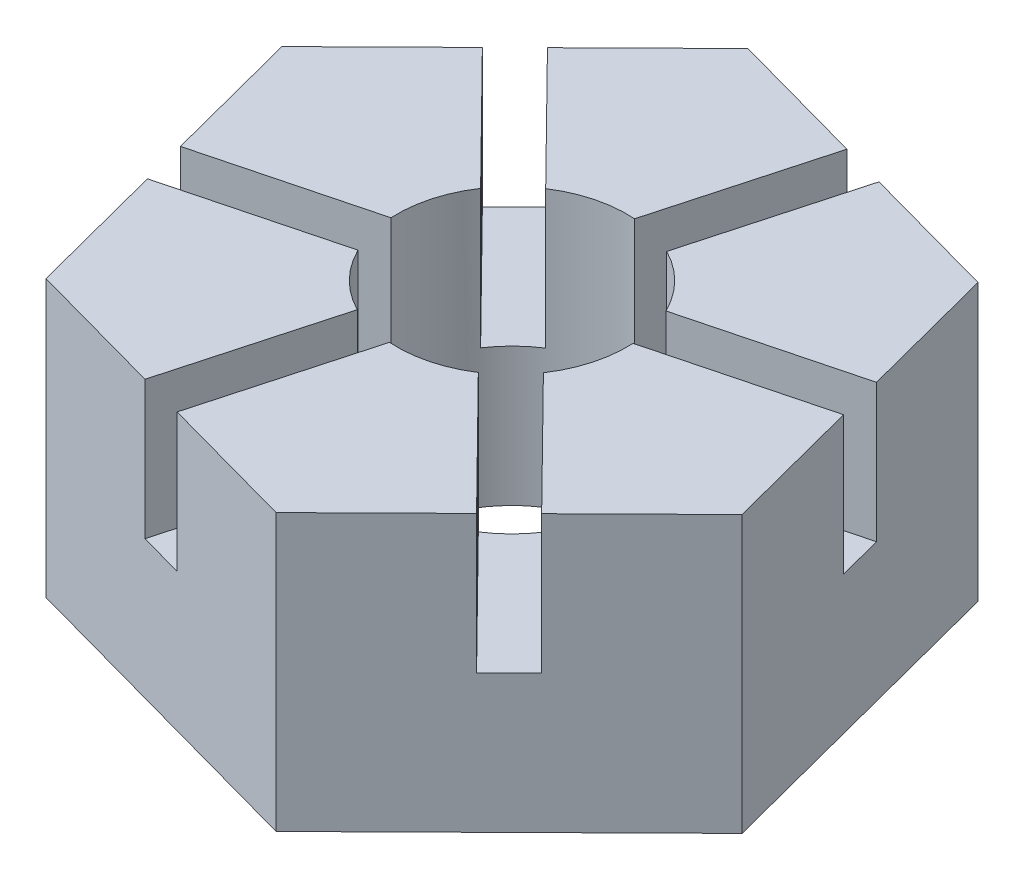
ISO-10303-21;
HEADER;
FILE_DESCRIPTION(('STEP AP214'),'2;1');
FILE_NAME('part.step','',(''),(''),'','','');
FILE_SCHEMA(('AUTOMOTIVE_DESIGN { 1 0 10303 214 1 1 1 1 }'));
ENDSEC;
DATA;
#1=APPLICATION_CONTEXT('core data for automotive mechanical design processes');
#2=APPLICATION_PROTOCOL_DEFINITION('international standard','automotive_design',2000,#1);
#3=PRODUCT_CONTEXT('',#1,'mechanical');
#4=PRODUCT('Part','Part','',(#3));
#5=PRODUCT_RELATED_PRODUCT_CATEGORY('part','',(#4));
#6=PRODUCT_DEFINITION_FORMATION('','',#4);
#7=PRODUCT_DEFINITION_CONTEXT('part definition',#1,'design');
#8=PRODUCT_DEFINITION('design','',#6,#7);
#9=PRODUCT_DEFINITION_SHAPE('','',#8);
#10=(LENGTH_UNIT() NAMED_UNIT(*) SI_UNIT(.MILLI.,.METRE.));
#11=(NAMED_UNIT(*) PLANE_ANGLE_UNIT() SI_UNIT($,.RADIAN.));
#12=(NAMED_UNIT(*) SI_UNIT($,.STERADIAN.) SOLID_ANGLE_UNIT());
#13=UNCERTAINTY_MEASURE_WITH_UNIT(LENGTH_MEASURE(1.E-05),#10,'distance_accuracy_value','');
#14=(GEOMETRIC_REPRESENTATION_CONTEXT(3) GLOBAL_UNCERTAINTY_ASSIGNED_CONTEXT((#13)) GLOBAL_UNIT_ASSIGNED_CONTEXT((#10,
#11,#12)) REPRESENTATION_CONTEXT('',''));
#15=CARTESIAN_POINT('',(0.,0.,0.));
#16=DIRECTION('',(0.,0.,1.));
#17=DIRECTION('',(1.,0.,0.));
#18=AXIS2_PLACEMENT_3D('',#15,#16,#17);
#19=CARTESIAN_POINT('',(0.,60.,0.));
#20=DIRECTION('',(0.,-1.,0.));
#21=DIRECTION('',(0.,0.,-1.));
#22=AXIS2_PLACEMENT_3D('',#19,#20,#21);
#23=CYLINDRICAL_SURFACE('',#22,25.);
#24=CARTESIAN_POINT('',(0.,0.,0.));
#25=DIRECTION('',(0.,1.,0.));
#26=DIRECTION('',(0.,0.,1.));
#27=AXIS2_PLACEMENT_3D('',#24,#25,#26);
#28=CIRCLE('',#27,25.);
#29=CARTESIAN_POINT('',(0.,0.,25.));
#30=VERTEX_POINT('',#29);
#31=EDGE_CURVE('E390',#30,#30,#28,.T.);
#32=ORIENTED_EDGE('',*,*,#31,.F.);
#33=EDGE_LOOP('',(#32));
#34=FACE_BOUND('',#33,.T.);
#35=CARTESIAN_POINT('',(0.,30.,0.));
#36=DIRECTION('',(0.,1.,0.));
#37=DIRECTION('',(0.,0.,1.));
#38=AXIS2_PLACEMENT_3D('',#35,#36,#37);
#39=CIRCLE('',#38,25.);
#40=CARTESIAN_POINT('',(-24.9645740933817,30.,1.33042862869604));
#41=VERTEX_POINT('',#40);
#42=CARTESIAN_POINT('',(-22.4459887611932,30.,11.008069246351));
#43=VERTEX_POINT('',#42);
#44=EDGE_CURVE('E598',#41,#43,#39,.T.);
#45=ORIENTED_EDGE('',*,*,#44,.T.);
#46=DIRECTION('',(0.,-1.,0.));
#47=VECTOR('',#46,1.);
#48=CARTESIAN_POINT('',(-22.4459887611932,60.,11.008069246351));
#49=LINE('',#48,#47);
#50=CARTESIAN_POINT('',(-22.4459887611932,60.,11.008069246351));
#51=VERTEX_POINT('',#50);
#52=EDGE_CURVE('E362',#51,#43,#49,.T.);
#53=ORIENTED_EDGE('',*,*,#52,.F.);
#54=CARTESIAN_POINT('',(0.,60.,0.));
#55=DIRECTION('',(0.,1.,0.));
#56=DIRECTION('',(0.,0.,1.));
#57=AXIS2_PLACEMENT_3D('',#54,#55,#56);
#58=CIRCLE('',#57,25.);
#59=CARTESIAN_POINT('',(-11.3301020563195,60.,22.2851696738764));
#60=VERTEX_POINT('',#59);
#61=EDGE_CURVE('E440',#51,#60,#58,.T.);
#62=ORIENTED_EDGE('',*,*,#61,.T.);
#63=DIRECTION('',(0.,-1.,0.));
#64=VECTOR('',#63,1.);
#65=CARTESIAN_POINT('',(-11.3301020563195,60.,22.2851696738764));
#66=LINE('',#65,#64);
#67=CARTESIAN_POINT('',(-11.3301020563195,30.,22.2851696738764));
#68=VERTEX_POINT('',#67);
#69=EDGE_CURVE('E435',#60,#68,#66,.T.);
#70=ORIENTED_EDGE('',*,*,#69,.T.);
#71=CARTESIAN_POINT('',(0.,30.,0.));
#72=DIRECTION('',(0.,1.,0.));
#73=DIRECTION('',(0.,0.,1.));
#74=AXIS2_PLACEMENT_3D('',#71,#72,#73);
#75=CIRCLE('',#74,25.);
#76=CARTESIAN_POINT('',(-1.68972676663987,30.,24.9428311034297));
#77=VERTEX_POINT('',#76);
#78=EDGE_CURVE('E372',#68,#77,#75,.T.);
#79=ORIENTED_EDGE('',*,*,#78,.T.);
#80=DIRECTION('',(0.,-1.,0.));
#81=VECTOR('',#80,1.);
#82=CARTESIAN_POINT('',(-1.68972676663987,60.,24.9428311034297));
#83=LINE('',#82,#81);
#84=CARTESIAN_POINT('',(-1.68972676663987,60.,24.9428311034297));
#85=VERTEX_POINT('',#84);
#86=EDGE_CURVE('E12',#85,#77,#83,.T.);
#87=ORIENTED_EDGE('',*,*,#86,.F.);
#88=CARTESIAN_POINT('',(0.,60.,0.));
#89=DIRECTION('',(0.,1.,0.));
#90=DIRECTION('',(0.,0.,1.));
#91=AXIS2_PLACEMENT_3D('',#88,#89,#90);
#92=CIRCLE('',#91,25.);
#93=CARTESIAN_POINT('',(13.6344720370624,60.,20.9547410451821));
#94=VERTEX_POINT('',#93);
#95=EDGE_CURVE('E391',#85,#94,#92,.T.);
#96=ORIENTED_EDGE('',*,*,#95,.T.);
#97=DIRECTION('',(0.,-1.,0.));
#98=VECTOR('',#97,1.);
#99=CARTESIAN_POINT('',(13.6344720370624,60.,20.9547410451821));
#100=LINE('',#99,#98);
#101=CARTESIAN_POINT('',(13.6344720370624,30.,20.9547410451821));
#102=VERTEX_POINT('',#101);
#103=EDGE_CURVE('E404',#94,#102,#100,.T.);
#104=ORIENTED_EDGE('',*,*,#103,.T.);
#105=CARTESIAN_POINT('',(0.,30.,0.));
#106=DIRECTION('',(0.,1.,0.));
#107=DIRECTION('',(0.,0.,1.));
#108=AXIS2_PLACEMENT_3D('',#105,#106,#107);
#109=CIRCLE('',#108,25.);
#110=CARTESIAN_POINT('',(20.7562619945534,30.,13.9347618570805));
#111=VERTEX_POINT('',#110);
#112=EDGE_CURVE('E457',#102,#111,#109,.T.);
#113=ORIENTED_EDGE('',*,*,#112,.T.);
#114=DIRECTION('',(0.,-1.,0.));
#115=VECTOR('',#114,1.);
#116=CARTESIAN_POINT('',(20.7562619945534,60.,13.9347618570805));
#117=LINE('',#116,#115);
#118=CARTESIAN_POINT('',(20.7562619945534,60.,13.9347618570805));
#119=VERTEX_POINT('',#118);
#120=EDGE_CURVE('E460',#119,#111,#117,.T.);
#121=ORIENTED_EDGE('',*,*,#120,.F.);
#122=CARTESIAN_POINT('',(0.,60.,0.));
#123=DIRECTION('',(0.,1.,0.));
#124=DIRECTION('',(0.,0.,1.));
#125=AXIS2_PLACEMENT_3D('',#122,#123,#124);
#126=CIRCLE('',#125,25.);
#127=CARTESIAN_POINT('',(24.9645740933819,60.,-1.33042862869258));
#128=VERTEX_POINT('',#127);
#129=EDGE_CURVE('E476',#119,#128,#126,.T.);
#130=ORIENTED_EDGE('',*,*,#129,.T.);
#131=DIRECTION('',(0.,-1.,0.));
#132=VECTOR('',#131,1.);
#133=CARTESIAN_POINT('',(24.9645740933819,60.,-1.33042862869258));
#134=LINE('',#133,#132);
#135=CARTESIAN_POINT('',(24.9645740933819,30.,-1.33042862869258));
#136=VERTEX_POINT('',#135);
#137=EDGE_CURVE('E470',#128,#136,#134,.T.);
#138=ORIENTED_EDGE('',*,*,#137,.T.);
#139=CARTESIAN_POINT('',(0.,30.,0.));
#140=DIRECTION('',(0.,1.,0.));
#141=DIRECTION('',(0.,0.,1.));
#142=AXIS2_PLACEMENT_3D('',#139,#140,#141);
#143=CIRCLE('',#142,25.);
#144=CARTESIAN_POINT('',(22.4459887611933,30.,-11.0080692463475));
#145=VERTEX_POINT('',#144);
#146=EDGE_CURVE('E495',#136,#145,#143,.T.);
#147=ORIENTED_EDGE('',*,*,#146,.T.);
#148=DIRECTION('',(0.,-1.,0.));
#149=VECTOR('',#148,1.);
#150=CARTESIAN_POINT('',(22.4459887611933,60.,-11.0080692463475));
#151=LINE('',#150,#149);
#152=CARTESIAN_POINT('',(22.4459887611933,60.,-11.0080692463475));
#153=VERTEX_POINT('',#152);
#154=EDGE_CURVE('E498',#153,#145,#151,.T.);
#155=ORIENTED_EDGE('',*,*,#154,.F.);
#156=CARTESIAN_POINT('',(0.,60.,0.));
#157=DIRECTION('',(0.,1.,0.));
#158=DIRECTION('',(0.,0.,1.));
#159=AXIS2_PLACEMENT_3D('',#156,#157,#158);
#160=CIRCLE('',#159,25.);
#161=CARTESIAN_POINT('',(11.3301020563196,60.,-22.285169673873));
#162=VERTEX_POINT('',#161);
#163=EDGE_CURVE('E514',#153,#162,#160,.T.);
#164=ORIENTED_EDGE('',*,*,#163,.T.);
#165=DIRECTION('',(0.,-1.,0.));
#166=VECTOR('',#165,1.);
#167=CARTESIAN_POINT('',(11.3301020563196,60.,-22.285169673873));
#168=LINE('',#167,#166);
#169=CARTESIAN_POINT('',(11.3301020563196,30.,-22.285169673873));
#170=VERTEX_POINT('',#169);
#171=EDGE_CURVE('E508',#162,#170,#168,.T.);
#172=ORIENTED_EDGE('',*,*,#171,.T.);
#173=CARTESIAN_POINT('',(0.,30.,0.));
#174=DIRECTION('',(0.,1.,0.));
#175=DIRECTION('',(0.,0.,1.));
#176=AXIS2_PLACEMENT_3D('',#173,#174,#175);
#177=CIRCLE('',#176,25.);
#178=CARTESIAN_POINT('',(1.68972676664002,30.,-24.9428311034263));
#179=VERTEX_POINT('',#178);
#180=EDGE_CURVE('E533',#170,#179,#177,.T.);
#181=ORIENTED_EDGE('',*,*,#180,.T.);
#182=DIRECTION('',(0.,-1.,0.));
#183=VECTOR('',#182,1.);
#184=CARTESIAN_POINT('',(1.68972676664002,60.,-24.9428311034263));
#185=LINE('',#184,#183);
#186=CARTESIAN_POINT('',(1.68972676664002,60.,-24.9428311034263));
#187=VERTEX_POINT('',#186);
#188=EDGE_CURVE('E536',#187,#179,#185,.T.);
#189=ORIENTED_EDGE('',*,*,#188,.F.);
#190=CARTESIAN_POINT('',(0.,60.,0.));
#191=DIRECTION('',(0.,1.,0.));
#192=DIRECTION('',(0.,0.,1.));
#193=AXIS2_PLACEMENT_3D('',#190,#191,#192);
#194=CIRCLE('',#193,25.);
#195=CARTESIAN_POINT('',(-13.6344720370622,60.,-20.9547410451787));
#196=VERTEX_POINT('',#195);
#197=EDGE_CURVE('E553',#187,#196,#194,.T.);
#198=ORIENTED_EDGE('',*,*,#197,.T.);
#199=DIRECTION('',(0.,-1.,0.));
#200=VECTOR('',#199,1.);
#201=CARTESIAN_POINT('',(-13.6344720370622,60.,-20.9547410451787));
#202=LINE('',#201,#200);
#203=CARTESIAN_POINT('',(-13.6344720370622,30.,-20.9547410451787));
#204=VERTEX_POINT('',#203);
#205=EDGE_CURVE('E546',#196,#204,#202,.T.);
#206=ORIENTED_EDGE('',*,*,#205,.T.);
#207=CARTESIAN_POINT('',(0.,30.,0.));
#208=DIRECTION('',(0.,1.,0.));
#209=DIRECTION('',(0.,0.,1.));
#210=AXIS2_PLACEMENT_3D('',#207,#208,#209);
#211=CIRCLE('',#210,25.);
#212=CARTESIAN_POINT('',(-20.7562619945532,30.,-13.934761857077));
#213=VERTEX_POINT('',#212);
#214=EDGE_CURVE('E572',#204,#213,#211,.T.);
#215=ORIENTED_EDGE('',*,*,#214,.T.);
#216=DIRECTION('',(0.,-1.,0.));
#217=VECTOR('',#216,1.);
#218=CARTESIAN_POINT('',(-20.7562619945532,60.,-13.934761857077));
#219=LINE('',#218,#217);
#220=CARTESIAN_POINT('',(-20.7562619945532,60.,-13.934761857077));
#221=VERTEX_POINT('',#220);
#222=EDGE_CURVE('E575',#221,#213,#219,.T.);
#223=ORIENTED_EDGE('',*,*,#222,.F.);
#224=CARTESIAN_POINT('',(0.,60.,0.));
#225=DIRECTION('',(0.,1.,0.));
#226=DIRECTION('',(0.,0.,1.));
#227=AXIS2_PLACEMENT_3D('',#224,#225,#226);
#228=CIRCLE('',#227,25.);
#229=CARTESIAN_POINT('',(-24.9645740933817,60.,1.33042862869604));
#230=VERTEX_POINT('',#229);
#231=EDGE_CURVE('E363',#221,#230,#228,.T.);
#232=ORIENTED_EDGE('',*,*,#231,.T.);
#233=DIRECTION('',(0.,-1.,0.));
#234=VECTOR('',#233,1.);
#235=CARTESIAN_POINT('',(-24.9645740933817,60.,1.33042862869604));
#236=LINE('',#235,#234);
#237=EDGE_CURVE('E584',#230,#41,#236,.T.);
#238=ORIENTED_EDGE('',*,*,#237,.T.);
#239=EDGE_LOOP('',(#45,#53,#62,#70,#79,#87,#96,#104,#113,#121,#130,#138,#147,#155,#164,#172,
#181,#189,#198,#206,#215,#223,#232,#238));
#240=FACE_BOUND('',#239,.T.);
#241=ADVANCED_FACE('F153',(#34,#240),#23,.F.);
#242=CARTESIAN_POINT('',(4.82018764484194,60.,1.32883071477724));
#243=DIRECTION('',(-0.964037528967958,0.,-0.26576614295533));
#244=DIRECTION('',(-0.26576614295533,0.,0.964037528967958));
#245=AXIS2_PLACEMENT_3D('',#242,#243,#244);
#246=PLANE('',#245);
#247=DIRECTION('',(0.26576614295533,0.,-0.964037528967958));
#248=VECTOR('',#247,1.);
#249=CARTESIAN_POINT('',(4.82018764484194,30.,1.32883071477724));
#250=LINE('',#249,#248);
#251=CARTESIAN_POINT('',(-11.6569364883166,30.,61.0977909637823));
#252=VERTEX_POINT('',#251);
#253=EDGE_CURVE('E387',#252,#77,#250,.T.);
#254=ORIENTED_EDGE('',*,*,#253,.F.);
#255=DIRECTION('',(0.,-1.,0.));
#256=VECTOR('',#255,1.);
#257=CARTESIAN_POINT('',(-11.6569364883166,60.,61.0977909637823));
#258=LINE('',#257,#256);
#259=CARTESIAN_POINT('',(-11.6569364883166,60.,61.0977909637823));
#260=VERTEX_POINT('',#259);
#261=EDGE_CURVE('E160',#260,#252,#258,.T.);
#262=ORIENTED_EDGE('',*,*,#261,.F.);
#263=DIRECTION('',(0.26576614295533,0.,-0.964037528967958));
#264=VECTOR('',#263,1.);
#265=CARTESIAN_POINT('',(4.82018764484194,60.,1.32883071477724));
#266=LINE('',#265,#264);
#267=EDGE_CURVE('E394',#260,#85,#266,.T.);
#268=ORIENTED_EDGE('',*,*,#267,.T.);
#269=ORIENTED_EDGE('',*,*,#86,.T.);
#270=EDGE_LOOP('',(#254,#262,#268,#269));
#271=FACE_BOUND('',#270,.T.);
#272=ADVANCED_FACE('F630',(#271),#246,.T.);
#273=CARTESIAN_POINT('',(-16.4771241331592,60.,59.7689602490048));
#274=DIRECTION('',(0.26576614295534,0.,-0.964037528967955));
#275=DIRECTION('',(-0.964037528967955,0.,-0.26576614295534));
#276=AXIS2_PLACEMENT_3D('',#273,#274,#275);
#277=PLANE('',#276);
#278=DIRECTION('',(0.964037528967955,0.,0.26576614295534));
#279=VECTOR('',#278,1.);
#280=CARTESIAN_POINT('',(-16.4771241331592,0.,59.7689602490048));
#281=LINE('',#280,#279);
#282=CARTESIAN_POINT('',(-50.9847494221061,0.,50.2558881952545));
#283=VERTEX_POINT('',#282);
#284=CARTESIAN_POINT('',(18.0305011557878,0.,69.2820323027552));
#285=VERTEX_POINT('',#284);
#286=EDGE_CURVE('E407',#283,#285,#281,.T.);
#287=ORIENTED_EDGE('',*,*,#286,.T.);
#288=DIRECTION('',(0.,-1.,0.));
#289=VECTOR('',#288,1.);
#290=CARTESIAN_POINT('',(18.0305011557878,60.,69.2820323027552));
#291=LINE('',#290,#289);
#292=CARTESIAN_POINT('',(18.0305011557878,60.,69.2820323027552));
#293=VERTEX_POINT('',#292);
#294=EDGE_CURVE('E414',#293,#285,#291,.T.);
#295=ORIENTED_EDGE('',*,*,#294,.F.);
#296=DIRECTION('',(0.964037528967955,0.,0.26576614295534));
#297=VECTOR('',#296,1.);
#298=CARTESIAN_POINT('',(-16.4771241331592,60.,59.7689602490048));
#299=LINE('',#298,#297);
#300=EDGE_CURVE('E398',#260,#293,#299,.T.);
#301=ORIENTED_EDGE('',*,*,#300,.F.);
#302=ORIENTED_EDGE('',*,*,#261,.T.);
#303=DIRECTION('',(0.964037528967955,0.,0.26576614295534));
#304=VECTOR('',#303,1.);
#305=CARTESIAN_POINT('',(-16.4771241331592,30.,59.7689602490048));
#306=LINE('',#305,#304);
#307=CARTESIAN_POINT('',(-21.2973117779962,30.,58.4401295342289));
#308=VERTEX_POINT('',#307);
#309=EDGE_CURVE('E384',#308,#252,#306,.T.);
#310=ORIENTED_EDGE('',*,*,#309,.F.);
#311=DIRECTION('',(0.,-1.,0.));
#312=VECTOR('',#311,1.);
#313=CARTESIAN_POINT('',(-21.2973117779962,60.,58.4401295342289));
#314=LINE('',#313,#312);
#315=CARTESIAN_POINT('',(-21.2973117779962,60.,58.4401295342289));
#316=VERTEX_POINT('',#315);
#317=EDGE_CURVE('E375',#316,#308,#314,.T.);
#318=ORIENTED_EDGE('',*,*,#317,.F.);
#319=DIRECTION('',(0.964037528967955,0.,0.26576614295534));
#320=VECTOR('',#319,1.);
#321=CARTESIAN_POINT('',(-16.4771241331592,60.,59.7689602490048));
#322=LINE('',#321,#320);
#323=CARTESIAN_POINT('',(-50.9847494221061,60.,50.2558881952545));
#324=VERTEX_POINT('',#323);
#325=EDGE_CURVE('E443',#324,#316,#322,.T.);
#326=ORIENTED_EDGE('',*,*,#325,.F.);
#327=DIRECTION('',(0.,-1.,0.));
#328=VECTOR('',#327,1.);
#329=CARTESIAN_POINT('',(-50.9847494221061,60.,50.2558881952545));
#330=LINE('',#329,#328);
#331=EDGE_CURVE('E370',#324,#283,#330,.T.);
#332=ORIENTED_EDGE('',*,*,#331,.T.);
#333=EDGE_LOOP('',(#287,#295,#301,#302,#310,#318,#326,#332));
#334=FACE_BOUND('',#333,.T.);
#335=ADVANCED_FACE('F419',(#334),#277,.F.);
#336=CARTESIAN_POINT('',(43.5228758668409,60.,44.1540882051279));
#337=DIRECTION('',(-0.701997918810156,0.,-0.712178995749109));
#338=DIRECTION('',(-0.712178995749109,0.,0.701997918810156));
#339=AXIS2_PLACEMENT_3D('',#336,#337,#338);
#340=PLANE('',#339);
#341=DIRECTION('',(0.712178995749109,0.,-0.701997918810156));
#342=VECTOR('',#341,1.);
#343=CARTESIAN_POINT('',(43.5228758668409,0.,44.1540882051279));
#344=LINE('',#343,#342);
#345=CARTESIAN_POINT('',(69.0152505778939,0.,19.0261441075007));
#346=VERTEX_POINT('',#345);
#347=EDGE_CURVE('E395',#285,#346,#344,.T.);
#348=ORIENTED_EDGE('',*,*,#347,.T.);
#349=DIRECTION('',(0.,-1.,0.));
#350=VECTOR('',#349,1.);
#351=CARTESIAN_POINT('',(69.0152505778939,60.,19.0261441075007));
#352=LINE('',#351,#350);
#353=CARTESIAN_POINT('',(69.0152505778939,60.,19.0261441075007));
#354=VERTEX_POINT('',#353);
#355=EDGE_CURVE('E465',#354,#346,#352,.T.);
#356=ORIENTED_EDGE('',*,*,#355,.F.);
#357=DIRECTION('',(0.712178995749109,0.,-0.701997918810156));
#358=VECTOR('',#357,1.);
#359=CARTESIAN_POINT('',(43.5228758668409,60.,44.1540882051279));
#360=LINE('',#359,#358);
#361=CARTESIAN_POINT('',(47.0837708455872,60.,40.6440986110763));
#362=VERTEX_POINT('',#361);
#363=EDGE_CURVE('E481',#362,#354,#360,.T.);
#364=ORIENTED_EDGE('',*,*,#363,.F.);
#365=DIRECTION('',(0.,-1.,0.));
#366=VECTOR('',#365,1.);
#367=CARTESIAN_POINT('',(47.0837708455872,60.,40.6440986110763));
#368=LINE('',#367,#366);
#369=CARTESIAN_POINT('',(47.0837708455872,30.,40.6440986110763));
#370=VERTEX_POINT('',#369);
#371=EDGE_CURVE('E462',#362,#370,#368,.T.);
#372=ORIENTED_EDGE('',*,*,#371,.T.);
#373=DIRECTION('',(0.712178995749109,0.,-0.701997918810156));
#374=VECTOR('',#373,1.);
#375=CARTESIAN_POINT('',(43.5228758668409,30.,44.1540882051279));
#376=LINE('',#375,#374);
#377=CARTESIAN_POINT('',(39.9619808880961,30.,47.6640777991778));
#378=VERTEX_POINT('',#377);
#379=EDGE_CURVE('E452',#378,#370,#376,.T.);
#380=ORIENTED_EDGE('',*,*,#379,.F.);
#381=DIRECTION('',(0.,-1.,0.));
#382=VECTOR('',#381,1.);
#383=CARTESIAN_POINT('',(39.9619808880961,60.,47.6640777991778));
#384=LINE('',#383,#382);
#385=CARTESIAN_POINT('',(39.9619808880961,60.,47.6640777991778));
#386=VERTEX_POINT('',#385);
#387=EDGE_CURVE('E412',#386,#378,#384,.T.);
#388=ORIENTED_EDGE('',*,*,#387,.F.);
#389=DIRECTION('',(0.712178995749109,0.,-0.701997918810156));
#390=VECTOR('',#389,1.);
#391=CARTESIAN_POINT('',(43.5228758668409,60.,44.1540882051279));
#392=LINE('',#391,#390);
#393=EDGE_CURVE('E400',#293,#386,#392,.T.);
#394=ORIENTED_EDGE('',*,*,#393,.F.);
#395=ORIENTED_EDGE('',*,*,#294,.T.);
#396=EDGE_LOOP('',(#348,#356,#364,#372,#380,#388,#394,#395));
#397=FACE_BOUND('',#396,.T.);
#398=ADVANCED_FACE('F621',(#397),#340,.F.);
#399=CARTESIAN_POINT('',(-3.56089497874513,60.,3.50998959405044));
#400=DIRECTION('',(-0.712178995749102,0.,0.701997918810164));
#401=DIRECTION('',(0.701997918810164,0.,0.712178995749102));
#402=AXIS2_PLACEMENT_3D('',#399,#400,#401);
#403=PLANE('',#402);
#404=ORIENTED_EDGE('',*,*,#387,.T.);
#405=DIRECTION('',(-0.701997918810164,0.,-0.712178995749102));
#406=VECTOR('',#405,1.);
#407=CARTESIAN_POINT('',(-3.56089497874513,30.,3.50998959405044));
#408=LINE('',#407,#406);
#409=EDGE_CURVE('E455',#378,#102,#408,.T.);
#410=ORIENTED_EDGE('',*,*,#409,.T.);
#411=ORIENTED_EDGE('',*,*,#103,.F.);
#412=DIRECTION('',(-0.701997918810164,0.,-0.712178995749102));
#413=VECTOR('',#412,1.);
#414=CARTESIAN_POINT('',(-3.56089497874513,60.,3.50998959405044));
#415=LINE('',#414,#413);
#416=EDGE_CURVE('E402',#386,#94,#415,.T.);
#417=ORIENTED_EDGE('',*,*,#416,.F.);
#418=EDGE_LOOP('',(#404,#410,#411,#417));
#419=FACE_BOUND('',#418,.T.);
#420=ADVANCED_FACE('F659',(#419),#403,.F.);
#421=CARTESIAN_POINT('',(0.,60.,0.));
#422=DIRECTION('',(0.,1.,0.));
#423=DIRECTION('',(0.,0.,1.));
#424=AXIS2_PLACEMENT_3D('',#421,#422,#423);
#425=PLANE('',#424);
#426=ORIENTED_EDGE('',*,*,#95,.F.);
#427=ORIENTED_EDGE('',*,*,#267,.F.);
#428=ORIENTED_EDGE('',*,*,#300,.T.);
#429=ORIENTED_EDGE('',*,*,#393,.T.);
#430=ORIENTED_EDGE('',*,*,#416,.T.);
#431=EDGE_LOOP('',(#426,#427,#428,#429,#430));
#432=FACE_BOUND('',#431,.T.);
#433=ADVANCED_FACE('F628',(#432),#425,.T.);
#434=CARTESIAN_POINT('',(0.,0.,0.));
#435=DIRECTION('',(0.,1.,0.));
#436=DIRECTION('',(0.,0.,1.));
#437=AXIS2_PLACEMENT_3D('',#434,#435,#436);
#438=PLANE('',#437);
#439=ORIENTED_EDGE('',*,*,#31,.T.);
#440=EDGE_LOOP('',(#439));
#441=FACE_BOUND('',#440,.T.);
#442=DIRECTION('',(0.251858533218847,0.,0.967764061765496));
#443=VECTOR('',#442,1.);
#444=CARTESIAN_POINT('',(-60.,0.,15.6148720438769));
#445=LINE('',#444,#443);
#446=CARTESIAN_POINT('',(-69.0152505778939,0.,-19.0261441075006));
#447=VERTEX_POINT('',#446);
#448=EDGE_CURVE('E438',#447,#283,#445,.T.);
#449=ORIENTED_EDGE('',*,*,#448,.F.);
#450=DIRECTION('',(-0.712178995749109,0.,0.701997918810156));
#451=VECTOR('',#450,1.);
#452=CARTESIAN_POINT('',(-43.5228758668409,0.,-44.1540882051279));
#453=LINE('',#452,#451);
#454=CARTESIAN_POINT('',(-18.0305011557878,0.,-69.2820323027551));
#455=VERTEX_POINT('',#454);
#456=EDGE_CURVE('E550',#455,#447,#453,.T.);
#457=ORIENTED_EDGE('',*,*,#456,.F.);
#458=DIRECTION('',(-0.964037528967956,0.,-0.26576614295534));
#459=VECTOR('',#458,1.);
#460=CARTESIAN_POINT('',(16.4771241331592,0.,-59.7689602490048));
#461=LINE('',#460,#459);
#462=CARTESIAN_POINT('',(50.9847494221061,0.,-50.2558881952545));
#463=VERTEX_POINT('',#462);
#464=EDGE_CURVE('E512',#463,#455,#461,.T.);
#465=ORIENTED_EDGE('',*,*,#464,.F.);
#466=DIRECTION('',(-0.251858533218847,0.,-0.967764061765496));
#467=VECTOR('',#466,1.);
#468=CARTESIAN_POINT('',(60.,0.,-15.6148720438769));
#469=LINE('',#468,#467);
#470=EDGE_CURVE('E474',#346,#463,#469,.T.);
#471=ORIENTED_EDGE('',*,*,#470,.F.);
#472=ORIENTED_EDGE('',*,*,#347,.F.);
#473=ORIENTED_EDGE('',*,*,#286,.F.);
#474=EDGE_LOOP('',(#449,#457,#465,#471,#472,#473));
#475=FACE_BOUND('',#474,.T.);
#476=ADVANCED_FACE('F616',(#441,#475),#438,.F.);
#477=CARTESIAN_POINT('',(0.,30.,0.));
#478=DIRECTION('',(0.,1.,0.));
#479=DIRECTION('',(0.,0.,1.));
#480=AXIS2_PLACEMENT_3D('',#477,#478,#479);
#481=PLANE('',#480);
#482=ORIENTED_EDGE('',*,*,#78,.F.);
#483=DIRECTION('',(0.26576614295533,0.,-0.964037528967958));
#484=VECTOR('',#483,1.);
#485=CARTESIAN_POINT('',(-4.82018764483765,30.,-1.32883071477606));
#486=LINE('',#485,#484);
#487=EDGE_CURVE('E381',#308,#68,#486,.T.);
#488=ORIENTED_EDGE('',*,*,#487,.F.);
#489=ORIENTED_EDGE('',*,*,#309,.T.);
#490=ORIENTED_EDGE('',*,*,#253,.T.);
#491=EDGE_LOOP('',(#482,#488,#489,#490));
#492=FACE_BOUND('',#491,.T.);
#493=ADVANCED_FACE('F426',(#492),#481,.T.);
#494=CARTESIAN_POINT('',(-4.82018764483765,60.,-1.32883071477606));
#495=DIRECTION('',(-0.964037528967958,0.,-0.26576614295533));
#496=DIRECTION('',(-0.26576614295533,0.,0.964037528967958));
#497=AXIS2_PLACEMENT_3D('',#494,#495,#496);
#498=PLANE('',#497);
#499=ORIENTED_EDGE('',*,*,#317,.T.);
#500=ORIENTED_EDGE('',*,*,#487,.T.);
#501=ORIENTED_EDGE('',*,*,#69,.F.);
#502=DIRECTION('',(0.26576614295533,0.,-0.964037528967958));
#503=VECTOR('',#502,1.);
#504=CARTESIAN_POINT('',(-4.82018764483765,60.,-1.32883071477606));
#505=LINE('',#504,#503);
#506=EDGE_CURVE('E433',#316,#60,#505,.T.);
#507=ORIENTED_EDGE('',*,*,#506,.F.);
#508=EDGE_LOOP('',(#499,#500,#501,#507));
#509=FACE_BOUND('',#508,.T.);
#510=ADVANCED_FACE('F432',(#509),#498,.F.);
#511=CARTESIAN_POINT('',(1.25929266609513,60.,4.83882030883074));
#512=DIRECTION('',(-0.251858533218857,0.,-0.967764061765494));
#513=DIRECTION('',(-0.967764061765494,0.,0.251858533218857));
#514=AXIS2_PLACEMENT_3D('',#511,#512,#513);
#515=PLANE('',#514);
#516=DIRECTION('',(0.967764061765494,0.,-0.251858533218857));
#517=VECTOR('',#516,1.);
#518=CARTESIAN_POINT('',(1.25929266609513,30.,4.83882030883074));
#519=LINE('',#518,#517);
#520=CARTESIAN_POINT('',(-58.7407073339048,30.,20.4536923527083));
#521=VERTEX_POINT('',#520);
#522=EDGE_CURVE('E351',#521,#43,#519,.T.);
#523=ORIENTED_EDGE('',*,*,#522,.F.);
#524=DIRECTION('',(0.,-1.,0.));
#525=VECTOR('',#524,1.);
#526=CARTESIAN_POINT('',(-58.7407073339048,60.,20.4536923527083));
#527=LINE('',#526,#525);
#528=CARTESIAN_POINT('',(-58.7407073339048,60.,20.4536923527083));
#529=VERTEX_POINT('',#528);
#530=EDGE_CURVE('E360',#529,#521,#527,.T.);
#531=ORIENTED_EDGE('',*,*,#530,.F.);
#532=DIRECTION('',(0.967764061765494,0.,-0.251858533218857));
#533=VECTOR('',#532,1.);
#534=CARTESIAN_POINT('',(1.25929266609513,60.,4.83882030883074));
#535=LINE('',#534,#533);
#536=EDGE_CURVE('E446',#529,#51,#535,.T.);
#537=ORIENTED_EDGE('',*,*,#536,.T.);
#538=ORIENTED_EDGE('',*,*,#52,.T.);
#539=EDGE_LOOP('',(#523,#531,#537,#538));
#540=FACE_BOUND('',#539,.T.);
#541=ADVANCED_FACE('F358',(#540),#515,.T.);
#542=CARTESIAN_POINT('',(-60.,60.,15.6148720438769));
#543=DIRECTION('',(0.967764061765496,0.,-0.251858533218847));
#544=DIRECTION('',(-0.251858533218847,0.,-0.967764061765496));
#545=AXIS2_PLACEMENT_3D('',#542,#543,#544);
#546=PLANE('',#545);
#547=ORIENTED_EDGE('',*,*,#448,.T.);
#548=ORIENTED_EDGE('',*,*,#331,.F.);
#549=DIRECTION('',(0.251858533218847,0.,0.967764061765496));
#550=VECTOR('',#549,1.);
#551=CARTESIAN_POINT('',(-60.,60.,15.6148720438769));
#552=LINE('',#551,#550);
#553=EDGE_CURVE('E368',#529,#324,#552,.T.);
#554=ORIENTED_EDGE('',*,*,#553,.F.);
#555=ORIENTED_EDGE('',*,*,#530,.T.);
#556=DIRECTION('',(0.251858533218847,0.,0.967764061765496));
#557=VECTOR('',#556,1.);
#558=CARTESIAN_POINT('',(-60.,30.,15.6148720438769));
#559=LINE('',#558,#557);
#560=CARTESIAN_POINT('',(-61.2592926660933,30.,10.7760517350533));
#561=VERTEX_POINT('',#560);
#562=EDGE_CURVE('E347',#561,#521,#559,.T.);
#563=ORIENTED_EDGE('',*,*,#562,.F.);
#564=DIRECTION('',(0.,-1.,0.));
#565=VECTOR('',#564,1.);
#566=CARTESIAN_POINT('',(-61.2592926660933,60.,10.7760517350533));
#567=LINE('',#566,#565);
#568=CARTESIAN_POINT('',(-61.2592926660933,60.,10.7760517350533));
#569=VERTEX_POINT('',#568);
#570=EDGE_CURVE('E167',#569,#561,#567,.T.);
#571=ORIENTED_EDGE('',*,*,#570,.F.);
#572=DIRECTION('',(0.251858533218847,0.,0.967764061765496));
#573=VECTOR('',#572,1.);
#574=CARTESIAN_POINT('',(-60.,60.,15.6148720438769));
#575=LINE('',#574,#573);
#576=CARTESIAN_POINT('',(-69.0152505778939,60.,-19.0261441075006));
#577=VERTEX_POINT('',#576);
#578=EDGE_CURVE('E588',#577,#569,#575,.T.);
#579=ORIENTED_EDGE('',*,*,#578,.F.);
#580=DIRECTION('',(0.,-1.,0.));
#581=VECTOR('',#580,1.);
#582=CARTESIAN_POINT('',(-69.0152505778939,60.,-19.0261441075006));
#583=LINE('',#582,#581);
#584=EDGE_CURVE('E580',#577,#447,#583,.T.);
#585=ORIENTED_EDGE('',*,*,#584,.T.);
#586=EDGE_LOOP('',(#547,#548,#554,#555,#563,#571,#579,#585));
#587=FACE_BOUND('',#586,.T.);
#588=ADVANCED_FACE('F366',(#587),#546,.F.);
#589=CARTESIAN_POINT('',(0.,60.,0.));
#590=DIRECTION('',(0.,1.,0.));
#591=DIRECTION('',(0.,0.,1.));
#592=AXIS2_PLACEMENT_3D('',#589,#590,#591);
#593=PLANE('',#592);
#594=ORIENTED_EDGE('',*,*,#61,.F.);
#595=ORIENTED_EDGE('',*,*,#536,.F.);
#596=ORIENTED_EDGE('',*,*,#553,.T.);
#597=ORIENTED_EDGE('',*,*,#325,.T.);
#598=ORIENTED_EDGE('',*,*,#506,.T.);
#599=EDGE_LOOP('',(#594,#595,#596,#597,#598));
#600=FACE_BOUND('',#599,.T.);
#601=ADVANCED_FACE('F632',(#600),#593,.T.);
#602=CARTESIAN_POINT('',(0.,30.,0.));
#603=DIRECTION('',(0.,1.,0.));
#604=DIRECTION('',(0.,0.,1.));
#605=AXIS2_PLACEMENT_3D('',#602,#603,#604);
#606=PLANE('',#605);
#607=ORIENTED_EDGE('',*,*,#112,.F.);
#608=ORIENTED_EDGE('',*,*,#409,.F.);
#609=ORIENTED_EDGE('',*,*,#379,.T.);
#610=DIRECTION('',(-0.701997918810164,0.,-0.712178995749102));
#611=VECTOR('',#610,1.);
#612=CARTESIAN_POINT('',(3.56089497874589,30.,-3.50998959405119));
#613=LINE('',#612,#611);
#614=EDGE_CURVE('E441',#370,#111,#613,.T.);
#615=ORIENTED_EDGE('',*,*,#614,.T.);
#616=EDGE_LOOP('',(#607,#608,#609,#615));
#617=FACE_BOUND('',#616,.T.);
#618=ADVANCED_FACE('F634',(#617),#606,.T.);
#619=CARTESIAN_POINT('',(3.56089497874589,60.,-3.50998959405119));
#620=DIRECTION('',(-0.712178995749102,0.,0.701997918810164));
#621=DIRECTION('',(0.701997918810164,0.,0.712178995749102));
#622=AXIS2_PLACEMENT_3D('',#619,#620,#621);
#623=PLANE('',#622);
#624=ORIENTED_EDGE('',*,*,#120,.T.);
#625=ORIENTED_EDGE('',*,*,#614,.F.);
#626=ORIENTED_EDGE('',*,*,#371,.F.);
#627=DIRECTION('',(-0.701997918810164,0.,-0.712178995749102));
#628=VECTOR('',#627,1.);
#629=CARTESIAN_POINT('',(3.56089497874589,60.,-3.50998959405119));
#630=LINE('',#629,#628);
#631=EDGE_CURVE('E483',#362,#119,#630,.T.);
#632=ORIENTED_EDGE('',*,*,#631,.T.);
#633=EDGE_LOOP('',(#624,#625,#626,#632));
#634=FACE_BOUND('',#633,.T.);
#635=ADVANCED_FACE('F640',(#634),#623,.T.);
#636=CARTESIAN_POINT('',(60.,60.,-15.6148720438769));
#637=DIRECTION('',(-0.967764061765496,0.,0.251858533218847));
#638=DIRECTION('',(0.251858533218847,0.,0.967764061765496));
#639=AXIS2_PLACEMENT_3D('',#636,#637,#638);
#640=PLANE('',#639);
#641=ORIENTED_EDGE('',*,*,#470,.T.);
#642=DIRECTION('',(0.,-1.,0.));
#643=VECTOR('',#642,1.);
#644=CARTESIAN_POINT('',(50.9847494221061,60.,-50.2558881952545));
#645=LINE('',#644,#643);
#646=CARTESIAN_POINT('',(50.9847494221061,60.,-50.2558881952545));
#647=VERTEX_POINT('',#646);
#648=EDGE_CURVE('E503',#647,#463,#645,.T.);
#649=ORIENTED_EDGE('',*,*,#648,.F.);
#650=DIRECTION('',(-0.251858533218847,0.,-0.967764061765496));
#651=VECTOR('',#650,1.);
#652=CARTESIAN_POINT('',(60.,60.,-15.6148720438769));
#653=LINE('',#652,#651);
#654=CARTESIAN_POINT('',(58.7407073339058,60.,-20.4536923527044));
#655=VERTEX_POINT('',#654);
#656=EDGE_CURVE('E519',#655,#647,#653,.T.);
#657=ORIENTED_EDGE('',*,*,#656,.F.);
#658=DIRECTION('',(0.,-1.,0.));
#659=VECTOR('',#658,1.);
#660=CARTESIAN_POINT('',(58.7407073339058,60.,-20.4536923527044));
#661=LINE('',#660,#659);
#662=CARTESIAN_POINT('',(58.7407073339058,30.,-20.4536923527044));
#663=VERTEX_POINT('',#662);
#664=EDGE_CURVE('E500',#655,#663,#661,.T.);
#665=ORIENTED_EDGE('',*,*,#664,.T.);
#666=DIRECTION('',(-0.251858533218847,0.,-0.967764061765496));
#667=VECTOR('',#666,1.);
#668=CARTESIAN_POINT('',(60.,30.,-15.6148720438769));
#669=LINE('',#668,#667);
#670=CARTESIAN_POINT('',(61.2592926660942,30.,-10.7760517350494));
#671=VERTEX_POINT('',#670);
#672=EDGE_CURVE('E490',#671,#663,#669,.T.);
#673=ORIENTED_EDGE('',*,*,#672,.F.);
#674=DIRECTION('',(0.,-1.,0.));
#675=VECTOR('',#674,1.);
#676=CARTESIAN_POINT('',(61.2592926660942,60.,-10.7760517350494));
#677=LINE('',#676,#675);
#678=CARTESIAN_POINT('',(61.2592926660942,60.,-10.7760517350494));
#679=VERTEX_POINT('',#678);
#680=EDGE_CURVE('E468',#679,#671,#677,.T.);
#681=ORIENTED_EDGE('',*,*,#680,.F.);
#682=DIRECTION('',(-0.251858533218847,0.,-0.967764061765496));
#683=VECTOR('',#682,1.);
#684=CARTESIAN_POINT('',(60.,60.,-15.6148720438769));
#685=LINE('',#684,#683);
#686=EDGE_CURVE('E479',#354,#679,#685,.T.);
#687=ORIENTED_EDGE('',*,*,#686,.F.);
#688=ORIENTED_EDGE('',*,*,#355,.T.);
#689=EDGE_LOOP('',(#641,#649,#657,#665,#673,#681,#687,#688));
#690=FACE_BOUND('',#689,.T.);
#691=ADVANCED_FACE('F787',(#690),#640,.F.);
#692=CARTESIAN_POINT('',(1.2592926660941,60.,4.83882030882709));
#693=DIRECTION('',(0.25185853321884,0.,0.967764061765498));
#694=DIRECTION('',(0.967764061765498,0.,-0.25185853321884));
#695=AXIS2_PLACEMENT_3D('',#692,#693,#694);
#696=PLANE('',#695);
#697=ORIENTED_EDGE('',*,*,#680,.T.);
#698=DIRECTION('',(-0.967764061765498,0.,0.25185853321884));
#699=VECTOR('',#698,1.);
#700=CARTESIAN_POINT('',(1.2592926660941,30.,4.83882030882709));
#701=LINE('',#700,#699);
#702=EDGE_CURVE('E493',#671,#136,#701,.T.);
#703=ORIENTED_EDGE('',*,*,#702,.T.);
#704=ORIENTED_EDGE('',*,*,#137,.F.);
#705=DIRECTION('',(-0.967764061765498,0.,0.25185853321884));
#706=VECTOR('',#705,1.);
#707=CARTESIAN_POINT('',(1.2592926660941,60.,4.83882030882709));
#708=LINE('',#707,#706);
#709=EDGE_CURVE('E473',#679,#128,#708,.T.);
#710=ORIENTED_EDGE('',*,*,#709,.F.);
#711=EDGE_LOOP('',(#697,#703,#704,#710));
#712=FACE_BOUND('',#711,.T.);
#713=ADVANCED_FACE('F793',(#712),#696,.F.);
#714=CARTESIAN_POINT('',(0.,60.,0.));
#715=DIRECTION('',(0.,1.,0.));
#716=DIRECTION('',(0.,0.,1.));
#717=AXIS2_PLACEMENT_3D('',#714,#715,#716);
#718=PLANE('',#717);
#719=ORIENTED_EDGE('',*,*,#129,.F.);
#720=ORIENTED_EDGE('',*,*,#631,.F.);
#721=ORIENTED_EDGE('',*,*,#363,.T.);
#722=ORIENTED_EDGE('',*,*,#686,.T.);
#723=ORIENTED_EDGE('',*,*,#709,.T.);
#724=EDGE_LOOP('',(#719,#720,#721,#722,#723));
#725=FACE_BOUND('',#724,.T.);
#726=ADVANCED_FACE('F969',(#725),#718,.T.);
#727=CARTESIAN_POINT('',(0.,30.,0.));
#728=DIRECTION('',(0.,1.,0.));
#729=DIRECTION('',(0.,0.,1.));
#730=AXIS2_PLACEMENT_3D('',#727,#728,#729);
#731=PLANE('',#730);
#732=ORIENTED_EDGE('',*,*,#146,.F.);
#733=ORIENTED_EDGE('',*,*,#702,.F.);
#734=ORIENTED_EDGE('',*,*,#672,.T.);
#735=DIRECTION('',(-0.967764061765498,0.,0.25185853321884));
#736=VECTOR('',#735,1.);
#737=CARTESIAN_POINT('',(-1.2592926660943,30.,-4.83882030882789));
#738=LINE('',#737,#736);
#739=EDGE_CURVE('E477',#663,#145,#738,.T.);
#740=ORIENTED_EDGE('',*,*,#739,.T.);
#741=EDGE_LOOP('',(#732,#733,#734,#740));
#742=FACE_BOUND('',#741,.T.);
#743=ADVANCED_FACE('F745',(#742),#731,.T.);
#744=CARTESIAN_POINT('',(-1.2592926660943,60.,-4.83882030882789));
#745=DIRECTION('',(0.25185853321884,0.,0.967764061765498));
#746=DIRECTION('',(0.967764061765498,0.,-0.25185853321884));
#747=AXIS2_PLACEMENT_3D('',#744,#745,#746);
#748=PLANE('',#747);
#749=ORIENTED_EDGE('',*,*,#154,.T.);
#750=ORIENTED_EDGE('',*,*,#739,.F.);
#751=ORIENTED_EDGE('',*,*,#664,.F.);
#752=DIRECTION('',(-0.967764061765498,0.,0.25185853321884));
#753=VECTOR('',#752,1.);
#754=CARTESIAN_POINT('',(-1.2592926660943,60.,-4.83882030882789));
#755=LINE('',#754,#753);
#756=EDGE_CURVE('E521',#655,#153,#755,.T.);
#757=ORIENTED_EDGE('',*,*,#756,.T.);
#758=EDGE_LOOP('',(#749,#750,#751,#757));
#759=FACE_BOUND('',#758,.T.);
#760=ADVANCED_FACE('F738',(#759),#748,.T.);
#761=CARTESIAN_POINT('',(16.4771241331592,60.,-59.7689602490048));
#762=DIRECTION('',(-0.26576614295534,0.,0.964037528967955));
#763=DIRECTION('',(0.964037528967956,0.,0.26576614295534));
#764=AXIS2_PLACEMENT_3D('',#761,#762,#763);
#765=PLANE('',#764);
#766=ORIENTED_EDGE('',*,*,#464,.T.);
#767=DIRECTION('',(0.,-1.,0.));
#768=VECTOR('',#767,1.);
#769=CARTESIAN_POINT('',(-18.0305011557878,60.,-69.2820323027551));
#770=LINE('',#769,#768);
#771=CARTESIAN_POINT('',(-18.0305011557878,60.,-69.2820323027551));
#772=VERTEX_POINT('',#771);
#773=EDGE_CURVE('E541',#772,#455,#770,.T.);
#774=ORIENTED_EDGE('',*,*,#773,.F.);
#775=DIRECTION('',(-0.964037528967956,0.,-0.26576614295534));
#776=VECTOR('',#775,1.);
#777=CARTESIAN_POINT('',(16.4771241331592,60.,-59.7689602490048));
#778=LINE('',#777,#776);
#779=CARTESIAN_POINT('',(11.6569364883176,60.,-61.097790963782));
#780=VERTEX_POINT('',#779);
#781=EDGE_CURVE('E558',#780,#772,#778,.T.);
#782=ORIENTED_EDGE('',*,*,#781,.F.);
#783=DIRECTION('',(0.,-1.,0.));
#784=VECTOR('',#783,1.);
#785=CARTESIAN_POINT('',(11.6569364883176,60.,-61.097790963782));
#786=LINE('',#785,#784);
#787=CARTESIAN_POINT('',(11.6569364883176,30.,-61.097790963782));
#788=VERTEX_POINT('',#787);
#789=EDGE_CURVE('E538',#780,#788,#786,.T.);
#790=ORIENTED_EDGE('',*,*,#789,.T.);
#791=DIRECTION('',(-0.964037528967956,0.,-0.26576614295534));
#792=VECTOR('',#791,1.);
#793=CARTESIAN_POINT('',(16.4771241331592,30.,-59.7689602490048));
#794=LINE('',#793,#792);
#795=CARTESIAN_POINT('',(21.2973117779972,30.,-58.4401295342286));
#796=VERTEX_POINT('',#795);
#797=EDGE_CURVE('E528',#796,#788,#794,.T.);
#798=ORIENTED_EDGE('',*,*,#797,.F.);
#799=DIRECTION('',(0.,-1.,0.));
#800=VECTOR('',#799,1.);
#801=CARTESIAN_POINT('',(21.2973117779972,60.,-58.4401295342286));
#802=LINE('',#801,#800);
#803=CARTESIAN_POINT('',(21.2973117779972,60.,-58.4401295342286));
#804=VERTEX_POINT('',#803);
#805=EDGE_CURVE('E506',#804,#796,#802,.T.);
#806=ORIENTED_EDGE('',*,*,#805,.F.);
#807=DIRECTION('',(-0.964037528967956,0.,-0.26576614295534));
#808=VECTOR('',#807,1.);
#809=CARTESIAN_POINT('',(16.4771241331592,60.,-59.7689602490048));
#810=LINE('',#809,#808);
#811=EDGE_CURVE('E517',#647,#804,#810,.T.);
#812=ORIENTED_EDGE('',*,*,#811,.F.);
#813=ORIENTED_EDGE('',*,*,#648,.T.);
#814=EDGE_LOOP('',(#766,#774,#782,#790,#798,#806,#812,#813));
#815=FACE_BOUND('',#814,.T.);
#816=ADVANCED_FACE('F744',(#815),#765,.F.);
#817=CARTESIAN_POINT('',(4.8201876448387,60.,1.32883071477634));
#818=DIRECTION('',(0.964037528967959,0.,0.265766142955329));
#819=DIRECTION('',(0.265766142955329,0.,-0.964037528967959));
#820=AXIS2_PLACEMENT_3D('',#817,#818,#819);
#821=PLANE('',#820);
#822=ORIENTED_EDGE('',*,*,#805,.T.);
#823=DIRECTION('',(-0.265766142955329,0.,0.964037528967959));
#824=VECTOR('',#823,1.);
#825=CARTESIAN_POINT('',(4.8201876448387,30.,1.32883071477634));
#826=LINE('',#825,#824);
#827=EDGE_CURVE('E531',#796,#170,#826,.T.);
#828=ORIENTED_EDGE('',*,*,#827,.T.);
#829=ORIENTED_EDGE('',*,*,#171,.F.);
#830=DIRECTION('',(-0.265766142955329,0.,0.964037528967959));
#831=VECTOR('',#830,1.);
#832=CARTESIAN_POINT('',(4.8201876448387,60.,1.32883071477634));
#833=LINE('',#832,#831);
#834=EDGE_CURVE('E511',#804,#162,#833,.T.);
#835=ORIENTED_EDGE('',*,*,#834,.F.);
#836=EDGE_LOOP('',(#822,#828,#829,#835));
#837=FACE_BOUND('',#836,.T.);
#838=ADVANCED_FACE('F756',(#837),#821,.F.);
#839=CARTESIAN_POINT('',(0.,60.,0.));
#840=DIRECTION('',(0.,1.,0.));
#841=DIRECTION('',(0.,0.,1.));
#842=AXIS2_PLACEMENT_3D('',#839,#840,#841);
#843=PLANE('',#842);
#844=ORIENTED_EDGE('',*,*,#163,.F.);
#845=ORIENTED_EDGE('',*,*,#756,.F.);
#846=ORIENTED_EDGE('',*,*,#656,.T.);
#847=ORIENTED_EDGE('',*,*,#811,.T.);
#848=ORIENTED_EDGE('',*,*,#834,.T.);
#849=EDGE_LOOP('',(#844,#845,#846,#847,#848));
#850=FACE_BOUND('',#849,.T.);
#851=ADVANCED_FACE('F768',(#850),#843,.T.);
#852=CARTESIAN_POINT('',(0.,30.,0.));
#853=DIRECTION('',(0.,1.,0.));
#854=DIRECTION('',(0.,0.,1.));
#855=AXIS2_PLACEMENT_3D('',#852,#853,#854);
#856=PLANE('',#855);
#857=ORIENTED_EDGE('',*,*,#180,.F.);
#858=ORIENTED_EDGE('',*,*,#827,.F.);
#859=ORIENTED_EDGE('',*,*,#797,.T.);
#860=DIRECTION('',(-0.265766142955329,0.,0.964037528967959));
#861=VECTOR('',#860,1.);
#862=CARTESIAN_POINT('',(-4.8201876448409,30.,-1.32883071477695));
#863=LINE('',#862,#861);
#864=EDGE_CURVE('E515',#788,#179,#863,.T.);
#865=ORIENTED_EDGE('',*,*,#864,.T.);
#866=EDGE_LOOP('',(#857,#858,#859,#865));
#867=FACE_BOUND('',#866,.T.);
#868=ADVANCED_FACE('F776',(#867),#856,.T.);
#869=CARTESIAN_POINT('',(-4.8201876448409,60.,-1.32883071477695));
#870=DIRECTION('',(0.964037528967959,0.,0.265766142955329));
#871=DIRECTION('',(0.265766142955329,0.,-0.964037528967959));
#872=AXIS2_PLACEMENT_3D('',#869,#870,#871);
#873=PLANE('',#872);
#874=ORIENTED_EDGE('',*,*,#188,.T.);
#875=ORIENTED_EDGE('',*,*,#864,.F.);
#876=ORIENTED_EDGE('',*,*,#789,.F.);
#877=DIRECTION('',(-0.265766142955329,0.,0.964037528967959));
#878=VECTOR('',#877,1.);
#879=CARTESIAN_POINT('',(-4.8201876448409,60.,-1.32883071477695));
#880=LINE('',#879,#878);
#881=EDGE_CURVE('E560',#780,#187,#880,.T.);
#882=ORIENTED_EDGE('',*,*,#881,.T.);
#883=EDGE_LOOP('',(#874,#875,#876,#882));
#884=FACE_BOUND('',#883,.T.);
#885=ADVANCED_FACE('F863',(#884),#873,.T.);
#886=CARTESIAN_POINT('',(-43.5228758668409,60.,-44.1540882051279));
#887=DIRECTION('',(0.701997918810156,0.,0.712178995749109));
#888=DIRECTION('',(0.712178995749109,0.,-0.701997918810156));
#889=AXIS2_PLACEMENT_3D('',#886,#887,#888);
#890=PLANE('',#889);
#891=ORIENTED_EDGE('',*,*,#456,.T.);
#892=ORIENTED_EDGE('',*,*,#584,.F.);
#893=DIRECTION('',(-0.712178995749109,0.,0.701997918810156));
#894=VECTOR('',#893,1.);
#895=CARTESIAN_POINT('',(-43.5228758668409,60.,-44.1540882051279));
#896=LINE('',#895,#894);
#897=CARTESIAN_POINT('',(-47.0837708455889,60.,-40.6440986110746));
#898=VERTEX_POINT('',#897);
#899=EDGE_CURVE('E590',#898,#577,#896,.T.);
#900=ORIENTED_EDGE('',*,*,#899,.F.);
#901=DIRECTION('',(0.,-1.,0.));
#902=VECTOR('',#901,1.);
#903=CARTESIAN_POINT('',(-47.0837708455889,60.,-40.6440986110746));
#904=LINE('',#903,#902);
#905=CARTESIAN_POINT('',(-47.0837708455889,30.,-40.6440986110746));
#906=VERTEX_POINT('',#905);
#907=EDGE_CURVE('E577',#898,#906,#904,.T.);
#908=ORIENTED_EDGE('',*,*,#907,.T.);
#909=DIRECTION('',(-0.712178995749109,0.,0.701997918810156));
#910=VECTOR('',#909,1.);
#911=CARTESIAN_POINT('',(-43.5228758668409,30.,-44.1540882051279));
#912=LINE('',#911,#910);
#913=CARTESIAN_POINT('',(-39.9619808880978,30.,-47.6640777991762));
#914=VERTEX_POINT('',#913);
#915=EDGE_CURVE('E567',#914,#906,#912,.T.);
#916=ORIENTED_EDGE('',*,*,#915,.F.);
#917=DIRECTION('',(0.,-1.,0.));
#918=VECTOR('',#917,1.);
#919=CARTESIAN_POINT('',(-39.9619808880978,60.,-47.6640777991762));
#920=LINE('',#919,#918);
#921=CARTESIAN_POINT('',(-39.9619808880978,60.,-47.6640777991762));
#922=VERTEX_POINT('',#921);
#923=EDGE_CURVE('E544',#922,#914,#920,.T.);
#924=ORIENTED_EDGE('',*,*,#923,.F.);
#925=DIRECTION('',(-0.712178995749109,0.,0.701997918810156));
#926=VECTOR('',#925,1.);
#927=CARTESIAN_POINT('',(-43.5228758668409,60.,-44.1540882051279));
#928=LINE('',#927,#926);
#929=EDGE_CURVE('E556',#772,#922,#928,.T.);
#930=ORIENTED_EDGE('',*,*,#929,.F.);
#931=ORIENTED_EDGE('',*,*,#773,.T.);
#932=EDGE_LOOP('',(#891,#892,#900,#908,#916,#924,#930,#931));
#933=FACE_BOUND('',#932,.T.);
#934=ADVANCED_FACE('F610',(#933),#890,.F.);
#935=CARTESIAN_POINT('',(3.56089497874349,60.,-3.50998959404883));
#936=DIRECTION('',(0.712178995749101,0.,-0.701997918810164));
#937=DIRECTION('',(-0.701997918810164,0.,-0.712178995749101));
#938=AXIS2_PLACEMENT_3D('',#935,#936,#937);
#939=PLANE('',#938);
#940=ORIENTED_EDGE('',*,*,#923,.T.);
#941=DIRECTION('',(0.701997918810164,0.,0.712178995749101));
#942=VECTOR('',#941,1.);
#943=CARTESIAN_POINT('',(3.56089497874349,30.,-3.50998959404883));
#944=LINE('',#943,#942);
#945=EDGE_CURVE('E570',#914,#204,#944,.T.);
#946=ORIENTED_EDGE('',*,*,#945,.T.);
#947=ORIENTED_EDGE('',*,*,#205,.F.);
#948=DIRECTION('',(0.701997918810164,0.,0.712178995749101));
#949=VECTOR('',#948,1.);
#950=CARTESIAN_POINT('',(3.56089497874349,60.,-3.50998959404883));
#951=LINE('',#950,#949);
#952=EDGE_CURVE('E549',#922,#196,#951,.T.);
#953=ORIENTED_EDGE('',*,*,#952,.F.);
#954=EDGE_LOOP('',(#940,#946,#947,#953));
#955=FACE_BOUND('',#954,.T.);
#956=ADVANCED_FACE('F862',(#955),#939,.F.);
#957=CARTESIAN_POINT('',(0.,60.,0.));
#958=DIRECTION('',(0.,1.,0.));
#959=DIRECTION('',(0.,0.,1.));
#960=AXIS2_PLACEMENT_3D('',#957,#958,#959);
#961=PLANE('',#960);
#962=ORIENTED_EDGE('',*,*,#197,.F.);
#963=ORIENTED_EDGE('',*,*,#881,.F.);
#964=ORIENTED_EDGE('',*,*,#781,.T.);
#965=ORIENTED_EDGE('',*,*,#929,.T.);
#966=ORIENTED_EDGE('',*,*,#952,.T.);
#967=EDGE_LOOP('',(#962,#963,#964,#965,#966));
#968=FACE_BOUND('',#967,.T.);
#969=ADVANCED_FACE('F923',(#968),#961,.T.);
#970=CARTESIAN_POINT('',(0.,30.,0.));
#971=DIRECTION('',(0.,1.,0.));
#972=DIRECTION('',(0.,0.,1.));
#973=AXIS2_PLACEMENT_3D('',#970,#971,#972);
#974=PLANE('',#973);
#975=ORIENTED_EDGE('',*,*,#214,.F.);
#976=ORIENTED_EDGE('',*,*,#945,.F.);
#977=ORIENTED_EDGE('',*,*,#915,.T.);
#978=DIRECTION('',(0.701997918810164,0.,0.712178995749101));
#979=VECTOR('',#978,1.);
#980=CARTESIAN_POINT('',(-3.56089497874753,30.,3.50998959405281));
#981=LINE('',#980,#979);
#982=EDGE_CURVE('E554',#906,#213,#981,.T.);
#983=ORIENTED_EDGE('',*,*,#982,.T.);
#984=EDGE_LOOP('',(#975,#976,#977,#983));
#985=FACE_BOUND('',#984,.T.);
#986=ADVANCED_FACE('F896',(#985),#974,.T.);
#987=CARTESIAN_POINT('',(-3.56089497874753,60.,3.50998959405281));
#988=DIRECTION('',(0.712178995749101,0.,-0.701997918810164));
#989=DIRECTION('',(-0.701997918810164,0.,-0.712178995749101));
#990=AXIS2_PLACEMENT_3D('',#987,#988,#989);
#991=PLANE('',#990);
#992=ORIENTED_EDGE('',*,*,#222,.T.);
#993=ORIENTED_EDGE('',*,*,#982,.F.);
#994=ORIENTED_EDGE('',*,*,#907,.F.);
#995=DIRECTION('',(0.701997918810164,0.,0.712178995749101));
#996=VECTOR('',#995,1.);
#997=CARTESIAN_POINT('',(-3.56089497874753,60.,3.50998959405281));
#998=LINE('',#997,#996);
#999=EDGE_CURVE('E592',#898,#221,#998,.T.);
#1000=ORIENTED_EDGE('',*,*,#999,.T.);
#1001=EDGE_LOOP('',(#992,#993,#994,#1000));
#1002=FACE_BOUND('',#1001,.T.);
#1003=ADVANCED_FACE('F891',(#1002),#991,.T.);
#1004=CARTESIAN_POINT('',(-1.25929266609344,60.,-4.83882030882421));
#1005=DIRECTION('',(-0.251858533218857,0.,-0.967764061765493));
#1006=DIRECTION('',(-0.967764061765494,0.,0.251858533218857));
#1007=AXIS2_PLACEMENT_3D('',#1004,#1005,#1006);
#1008=PLANE('',#1007);
#1009=ORIENTED_EDGE('',*,*,#570,.T.);
#1010=DIRECTION('',(0.967764061765494,0.,-0.251858533218857));
#1011=VECTOR('',#1010,1.);
#1012=CARTESIAN_POINT('',(-1.25929266609344,30.,-4.83882030882421));
#1013=LINE('',#1012,#1011);
#1014=EDGE_CURVE('E172',#561,#41,#1013,.T.);
#1015=ORIENTED_EDGE('',*,*,#1014,.T.);
#1016=ORIENTED_EDGE('',*,*,#237,.F.);
#1017=DIRECTION('',(0.967764061765494,0.,-0.251858533218857));
#1018=VECTOR('',#1017,1.);
#1019=CARTESIAN_POINT('',(-1.25929266609344,60.,-4.83882030882421));
#1020=LINE('',#1019,#1018);
#1021=EDGE_CURVE('E586',#569,#230,#1020,.T.);
#1022=ORIENTED_EDGE('',*,*,#1021,.F.);
#1023=EDGE_LOOP('',(#1009,#1015,#1016,#1022));
#1024=FACE_BOUND('',#1023,.T.);
#1025=ADVANCED_FACE('F602',(#1024),#1008,.F.);
#1026=CARTESIAN_POINT('',(0.,60.,0.));
#1027=DIRECTION('',(0.,1.,0.));
#1028=DIRECTION('',(0.,0.,1.));
#1029=AXIS2_PLACEMENT_3D('',#1026,#1027,#1028);
#1030=PLANE('',#1029);
#1031=ORIENTED_EDGE('',*,*,#231,.F.);
#1032=ORIENTED_EDGE('',*,*,#999,.F.);
#1033=ORIENTED_EDGE('',*,*,#899,.T.);
#1034=ORIENTED_EDGE('',*,*,#578,.T.);
#1035=ORIENTED_EDGE('',*,*,#1021,.T.);
#1036=EDGE_LOOP('',(#1031,#1032,#1033,#1034,#1035));
#1037=FACE_BOUND('',#1036,.T.);
#1038=ADVANCED_FACE('F604',(#1037),#1030,.T.);
#1039=CARTESIAN_POINT('',(0.,30.,0.));
#1040=DIRECTION('',(0.,1.,0.));
#1041=DIRECTION('',(0.,0.,1.));
#1042=AXIS2_PLACEMENT_3D('',#1039,#1040,#1041);
#1043=PLANE('',#1042);
#1044=ORIENTED_EDGE('',*,*,#44,.F.);
#1045=ORIENTED_EDGE('',*,*,#1014,.F.);
#1046=ORIENTED_EDGE('',*,*,#562,.T.);
#1047=ORIENTED_EDGE('',*,*,#522,.T.);
#1048=EDGE_LOOP('',(#1044,#1045,#1046,#1047));
#1049=FACE_BOUND('',#1048,.T.);
#1050=ADVANCED_FACE('F350',(#1049),#1043,.T.);
#1051=CLOSED_SHELL('',(#241,#272,#335,#398,#420,#433,#476,#493,#510,#541,#588,#601,#618,#635,
#691,#713,#726,#743,#760,#816,#838,#851,#868,#885,#934,#956,#969,#986,#1003,#1025,#1038,#1050));
#1052=MANIFOLD_SOLID_BREP('B2',#1051);
#1053=ADVANCED_BREP_SHAPE_REPRESENTATION('',(#18,#1052),#14);
#1054=SHAPE_DEFINITION_REPRESENTATION(#9,#1053);
ENDSEC;
END-ISO-10303-21;
